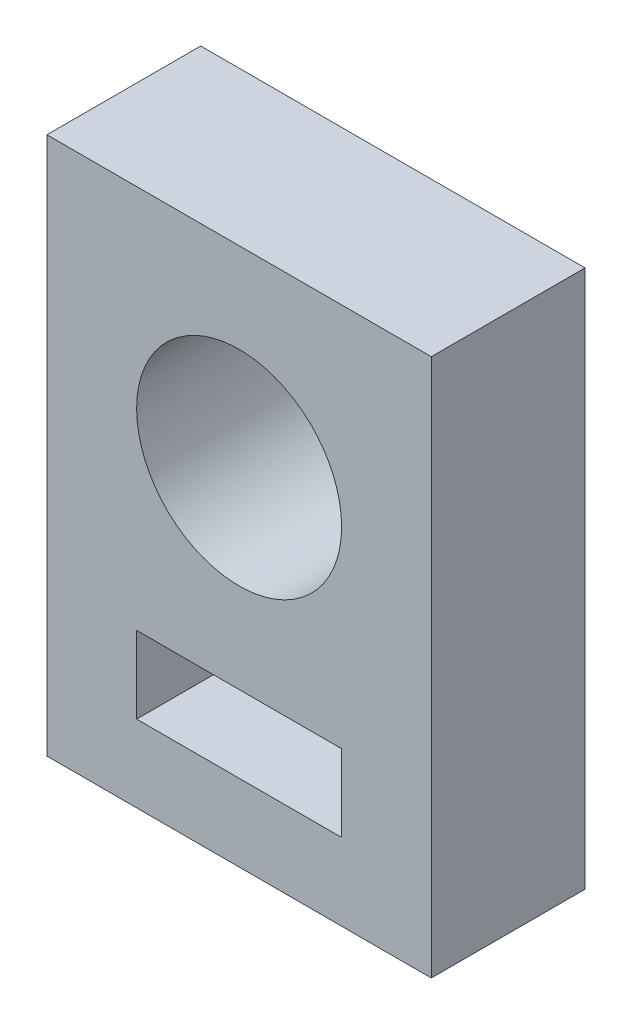
ISO-10303-21;
HEADER;
FILE_DESCRIPTION(('STEP AP214'),'2;1');
FILE_NAME('part.step','',(''),(''),'','','');
FILE_SCHEMA(('AUTOMOTIVE_DESIGN { 1 0 10303 214 1 1 1 1 }'));
ENDSEC;
DATA;
#1=APPLICATION_CONTEXT('core data for automotive mechanical design processes');
#2=APPLICATION_PROTOCOL_DEFINITION('international standard','automotive_design',2000,#1);
#3=PRODUCT_CONTEXT('',#1,'mechanical');
#4=PRODUCT('Part','Part','',(#3));
#5=PRODUCT_RELATED_PRODUCT_CATEGORY('part','',(#4));
#6=PRODUCT_DEFINITION_FORMATION('','',#4);
#7=PRODUCT_DEFINITION_CONTEXT('part definition',#1,'design');
#8=PRODUCT_DEFINITION('design','',#6,#7);
#9=PRODUCT_DEFINITION_SHAPE('','',#8);
#10=(LENGTH_UNIT() NAMED_UNIT(*) SI_UNIT(.MILLI.,.METRE.));
#11=(NAMED_UNIT(*) PLANE_ANGLE_UNIT() SI_UNIT($,.RADIAN.));
#12=(NAMED_UNIT(*) SI_UNIT($,.STERADIAN.) SOLID_ANGLE_UNIT());
#13=UNCERTAINTY_MEASURE_WITH_UNIT(LENGTH_MEASURE(1.E-05),#10,'distance_accuracy_value','');
#14=(GEOMETRIC_REPRESENTATION_CONTEXT(3) GLOBAL_UNCERTAINTY_ASSIGNED_CONTEXT((#13)) GLOBAL_UNIT_ASSIGNED_CONTEXT((#10,
#11,#12)) REPRESENTATION_CONTEXT('',''));
#15=CARTESIAN_POINT('',(0.,0.,0.));
#16=DIRECTION('',(0.,0.,1.));
#17=DIRECTION('',(1.,0.,0.));
#18=AXIS2_PLACEMENT_3D('',#15,#16,#17);
#19=CARTESIAN_POINT('',(0.,0.,6.));
#20=DIRECTION('',(0.,0.,-1.));
#21=DIRECTION('',(-1.,0.,0.));
#22=AXIS2_PLACEMENT_3D('',#19,#20,#21);
#23=PLANE('',#22);
#24=CARTESIAN_POINT('',(0.,3.,6.));
#25=DIRECTION('',(0.,0.,1.));
#26=DIRECTION('',(1.,0.,0.));
#27=AXIS2_PLACEMENT_3D('',#24,#25,#26);
#28=CIRCLE('',#27,4.);
#29=CARTESIAN_POINT('',(4.,3.,6.));
#30=VERTEX_POINT('',#29);
#31=EDGE_CURVE('E137',#30,#30,#28,.T.);
#32=ORIENTED_EDGE('',*,*,#31,.F.);
#33=EDGE_LOOP('',(#32));
#34=FACE_BOUND('',#33,.T.);
#35=DIRECTION('',(0.,1.,0.));
#36=VECTOR('',#35,1.);
#37=CARTESIAN_POINT('',(7.5,-10.5,6.));
#38=LINE('',#37,#36);
#39=CARTESIAN_POINT('',(7.5,-10.5,6.));
#40=VERTEX_POINT('',#39);
#41=CARTESIAN_POINT('',(7.5,10.5,6.));
#42=VERTEX_POINT('',#41);
#43=EDGE_CURVE('E143',#40,#42,#38,.T.);
#44=ORIENTED_EDGE('',*,*,#43,.T.);
#45=DIRECTION('',(-1.,0.,0.));
#46=VECTOR('',#45,1.);
#47=CARTESIAN_POINT('',(-7.5,10.5,6.));
#48=LINE('',#47,#46);
#49=CARTESIAN_POINT('',(-7.5,10.5,6.));
#50=VERTEX_POINT('',#49);
#51=EDGE_CURVE('E146',#42,#50,#48,.T.);
#52=ORIENTED_EDGE('',*,*,#51,.T.);
#53=DIRECTION('',(0.,-1.,0.));
#54=VECTOR('',#53,1.);
#55=CARTESIAN_POINT('',(-7.5,-10.5,6.));
#56=LINE('',#55,#54);
#57=CARTESIAN_POINT('',(-7.5,-10.5,6.));
#58=VERTEX_POINT('',#57);
#59=EDGE_CURVE('E149',#50,#58,#56,.T.);
#60=ORIENTED_EDGE('',*,*,#59,.T.);
#61=DIRECTION('',(1.,0.,0.));
#62=VECTOR('',#61,1.);
#63=CARTESIAN_POINT('',(-7.5,-10.5,6.));
#64=LINE('',#63,#62);
#65=EDGE_CURVE('E151',#58,#40,#64,.T.);
#66=ORIENTED_EDGE('',*,*,#65,.T.);
#67=EDGE_LOOP('',(#44,#52,#60,#66));
#68=FACE_BOUND('',#67,.T.);
#69=DIRECTION('',(0.,1.,0.));
#70=VECTOR('',#69,1.);
#71=CARTESIAN_POINT('',(4.,-7.5,6.));
#72=LINE('',#71,#70);
#73=CARTESIAN_POINT('',(4.,-7.5,6.));
#74=VERTEX_POINT('',#73);
#75=CARTESIAN_POINT('',(4.,-4.5,6.));
#76=VERTEX_POINT('',#75);
#77=EDGE_CURVE('E101',#74,#76,#72,.T.);
#78=ORIENTED_EDGE('',*,*,#77,.F.);
#79=DIRECTION('',(1.,0.,0.));
#80=VECTOR('',#79,1.);
#81=CARTESIAN_POINT('',(-4.,-7.5,6.));
#82=LINE('',#81,#80);
#83=CARTESIAN_POINT('',(-4.,-7.5,6.));
#84=VERTEX_POINT('',#83);
#85=EDGE_CURVE('E123',#84,#74,#82,.T.);
#86=ORIENTED_EDGE('',*,*,#85,.F.);
#87=DIRECTION('',(0.,-1.,0.));
#88=VECTOR('',#87,1.);
#89=CARTESIAN_POINT('',(-4.,-7.5,6.));
#90=LINE('',#89,#88);
#91=CARTESIAN_POINT('',(-4.,-4.5,6.));
#92=VERTEX_POINT('',#91);
#93=EDGE_CURVE('E121',#92,#84,#90,.T.);
#94=ORIENTED_EDGE('',*,*,#93,.F.);
#95=DIRECTION('',(-1.,0.,0.));
#96=VECTOR('',#95,1.);
#97=CARTESIAN_POINT('',(-4.,-4.5,6.));
#98=LINE('',#97,#96);
#99=EDGE_CURVE('E109',#76,#92,#98,.T.);
#100=ORIENTED_EDGE('',*,*,#99,.F.);
#101=EDGE_LOOP('',(#78,#86,#94,#100));
#102=FACE_BOUND('',#101,.T.);
#103=ADVANCED_FACE('F36',(#34,#68,#102),#23,.F.);
#104=CARTESIAN_POINT('',(0.,0.,0.));
#105=DIRECTION('',(0.,0.,-1.));
#106=DIRECTION('',(-1.,0.,0.));
#107=AXIS2_PLACEMENT_3D('',#104,#105,#106);
#108=PLANE('',#107);
#109=DIRECTION('',(0.,1.,0.));
#110=VECTOR('',#109,1.);
#111=CARTESIAN_POINT('',(7.5,-10.5,0.));
#112=LINE('',#111,#110);
#113=CARTESIAN_POINT('',(7.5,-10.5,0.));
#114=VERTEX_POINT('',#113);
#115=CARTESIAN_POINT('',(7.5,10.5,0.));
#116=VERTEX_POINT('',#115);
#117=EDGE_CURVE('E140',#114,#116,#112,.T.);
#118=ORIENTED_EDGE('',*,*,#117,.F.);
#119=DIRECTION('',(1.,0.,0.));
#120=VECTOR('',#119,1.);
#121=CARTESIAN_POINT('',(-7.5,-10.5,0.));
#122=LINE('',#121,#120);
#123=CARTESIAN_POINT('',(-7.5,-10.5,0.));
#124=VERTEX_POINT('',#123);
#125=EDGE_CURVE('E147',#124,#114,#122,.T.);
#126=ORIENTED_EDGE('',*,*,#125,.F.);
#127=DIRECTION('',(0.,-1.,0.));
#128=VECTOR('',#127,1.);
#129=CARTESIAN_POINT('',(-7.5,-10.5,0.));
#130=LINE('',#129,#128);
#131=CARTESIAN_POINT('',(-7.5,10.5,0.));
#132=VERTEX_POINT('',#131);
#133=EDGE_CURVE('E158',#132,#124,#130,.T.);
#134=ORIENTED_EDGE('',*,*,#133,.F.);
#135=DIRECTION('',(-1.,0.,0.));
#136=VECTOR('',#135,1.);
#137=CARTESIAN_POINT('',(-7.5,10.5,0.));
#138=LINE('',#137,#136);
#139=EDGE_CURVE('E156',#116,#132,#138,.T.);
#140=ORIENTED_EDGE('',*,*,#139,.F.);
#141=EDGE_LOOP('',(#118,#126,#134,#140));
#142=FACE_BOUND('',#141,.T.);
#143=CARTESIAN_POINT('',(0.,3.,0.));
#144=DIRECTION('',(0.,0.,1.));
#145=DIRECTION('',(1.,0.,0.));
#146=AXIS2_PLACEMENT_3D('',#143,#144,#145);
#147=CIRCLE('',#146,4.);
#148=CARTESIAN_POINT('',(4.,3.,0.));
#149=VERTEX_POINT('',#148);
#150=EDGE_CURVE('E117',#149,#149,#147,.T.);
#151=ORIENTED_EDGE('',*,*,#150,.T.);
#152=EDGE_LOOP('',(#151));
#153=FACE_BOUND('',#152,.T.);
#154=DIRECTION('',(1.,0.,0.));
#155=VECTOR('',#154,1.);
#156=CARTESIAN_POINT('',(-4.,-7.5,0.));
#157=LINE('',#156,#155);
#158=CARTESIAN_POINT('',(-4.,-7.5,0.));
#159=VERTEX_POINT('',#158);
#160=CARTESIAN_POINT('',(4.,-7.5,0.));
#161=VERTEX_POINT('',#160);
#162=EDGE_CURVE('E110',#159,#161,#157,.T.);
#163=ORIENTED_EDGE('',*,*,#162,.T.);
#164=DIRECTION('',(0.,1.,0.));
#165=VECTOR('',#164,1.);
#166=CARTESIAN_POINT('',(4.,-7.5,0.));
#167=LINE('',#166,#165);
#168=CARTESIAN_POINT('',(4.,-4.5,0.));
#169=VERTEX_POINT('',#168);
#170=EDGE_CURVE('E59',#161,#169,#167,.T.);
#171=ORIENTED_EDGE('',*,*,#170,.T.);
#172=DIRECTION('',(-1.,0.,0.));
#173=VECTOR('',#172,1.);
#174=CARTESIAN_POINT('',(-4.,-4.5,0.));
#175=LINE('',#174,#173);
#176=CARTESIAN_POINT('',(-4.,-4.5,0.));
#177=VERTEX_POINT('',#176);
#178=EDGE_CURVE('E116',#169,#177,#175,.T.);
#179=ORIENTED_EDGE('',*,*,#178,.T.);
#180=DIRECTION('',(0.,-1.,0.));
#181=VECTOR('',#180,1.);
#182=CARTESIAN_POINT('',(-4.,-7.5,0.));
#183=LINE('',#182,#181);
#184=EDGE_CURVE('E129',#177,#159,#183,.T.);
#185=ORIENTED_EDGE('',*,*,#184,.T.);
#186=EDGE_LOOP('',(#163,#171,#179,#185));
#187=FACE_BOUND('',#186,.T.);
#188=ADVANCED_FACE('F176',(#142,#153,#187),#108,.T.);
#189=CARTESIAN_POINT('',(7.5,-10.5,6.));
#190=DIRECTION('',(-1.,0.,0.));
#191=DIRECTION('',(0.,0.,1.));
#192=AXIS2_PLACEMENT_3D('',#189,#190,#191);
#193=PLANE('',#192);
#194=ORIENTED_EDGE('',*,*,#117,.T.);
#195=DIRECTION('',(0.,0.,-1.));
#196=VECTOR('',#195,1.);
#197=CARTESIAN_POINT('',(7.5,10.5,6.));
#198=LINE('',#197,#196);
#199=EDGE_CURVE('E11',#42,#116,#198,.T.);
#200=ORIENTED_EDGE('',*,*,#199,.F.);
#201=ORIENTED_EDGE('',*,*,#43,.F.);
#202=DIRECTION('',(0.,0.,-1.));
#203=VECTOR('',#202,1.);
#204=CARTESIAN_POINT('',(7.5,-10.5,6.));
#205=LINE('',#204,#203);
#206=EDGE_CURVE('E153',#40,#114,#205,.T.);
#207=ORIENTED_EDGE('',*,*,#206,.T.);
#208=EDGE_LOOP('',(#194,#200,#201,#207));
#209=FACE_BOUND('',#208,.T.);
#210=ADVANCED_FACE('F38',(#209),#193,.F.);
#211=CARTESIAN_POINT('',(-7.5,10.5,6.));
#212=DIRECTION('',(0.,-1.,0.));
#213=DIRECTION('',(0.,0.,-1.));
#214=AXIS2_PLACEMENT_3D('',#211,#212,#213);
#215=PLANE('',#214);
#216=ORIENTED_EDGE('',*,*,#139,.T.);
#217=DIRECTION('',(0.,0.,-1.));
#218=VECTOR('',#217,1.);
#219=CARTESIAN_POINT('',(-7.5,10.5,6.));
#220=LINE('',#219,#218);
#221=EDGE_CURVE('E44',#50,#132,#220,.T.);
#222=ORIENTED_EDGE('',*,*,#221,.F.);
#223=ORIENTED_EDGE('',*,*,#51,.F.);
#224=ORIENTED_EDGE('',*,*,#199,.T.);
#225=EDGE_LOOP('',(#216,#222,#223,#224));
#226=FACE_BOUND('',#225,.T.);
#227=ADVANCED_FACE('F186',(#226),#215,.F.);
#228=CARTESIAN_POINT('',(-7.5,-10.5,6.));
#229=DIRECTION('',(1.,0.,0.));
#230=DIRECTION('',(0.,0.,-1.));
#231=AXIS2_PLACEMENT_3D('',#228,#229,#230);
#232=PLANE('',#231);
#233=ORIENTED_EDGE('',*,*,#133,.T.);
#234=DIRECTION('',(0.,0.,-1.));
#235=VECTOR('',#234,1.);
#236=CARTESIAN_POINT('',(-7.5,-10.5,6.));
#237=LINE('',#236,#235);
#238=EDGE_CURVE('E163',#58,#124,#237,.T.);
#239=ORIENTED_EDGE('',*,*,#238,.F.);
#240=ORIENTED_EDGE('',*,*,#59,.F.);
#241=ORIENTED_EDGE('',*,*,#221,.T.);
#242=EDGE_LOOP('',(#233,#239,#240,#241));
#243=FACE_BOUND('',#242,.T.);
#244=ADVANCED_FACE('F170',(#243),#232,.F.);
#245=CARTESIAN_POINT('',(-7.5,-10.5,6.));
#246=DIRECTION('',(0.,1.,0.));
#247=DIRECTION('',(0.,0.,1.));
#248=AXIS2_PLACEMENT_3D('',#245,#246,#247);
#249=PLANE('',#248);
#250=ORIENTED_EDGE('',*,*,#125,.T.);
#251=ORIENTED_EDGE('',*,*,#206,.F.);
#252=ORIENTED_EDGE('',*,*,#65,.F.);
#253=ORIENTED_EDGE('',*,*,#238,.T.);
#254=EDGE_LOOP('',(#250,#251,#252,#253));
#255=FACE_BOUND('',#254,.T.);
#256=ADVANCED_FACE('F180',(#255),#249,.F.);
#257=CARTESIAN_POINT('',(0.,3.,6.));
#258=DIRECTION('',(0.,0.,-1.));
#259=DIRECTION('',(-1.,0.,0.));
#260=AXIS2_PLACEMENT_3D('',#257,#258,#259);
#261=CYLINDRICAL_SURFACE('',#260,4.);
#262=ORIENTED_EDGE('',*,*,#31,.T.);
#263=EDGE_LOOP('',(#262));
#264=FACE_BOUND('',#263,.T.);
#265=ORIENTED_EDGE('',*,*,#150,.F.);
#266=EDGE_LOOP('',(#265));
#267=FACE_BOUND('',#266,.T.);
#268=ADVANCED_FACE('F202',(#264,#267),#261,.F.);
#269=CARTESIAN_POINT('',(4.,-7.5,6.));
#270=DIRECTION('',(-1.,0.,0.));
#271=DIRECTION('',(0.,0.,1.));
#272=AXIS2_PLACEMENT_3D('',#269,#270,#271);
#273=PLANE('',#272);
#274=ORIENTED_EDGE('',*,*,#170,.F.);
#275=DIRECTION('',(0.,0.,-1.));
#276=VECTOR('',#275,1.);
#277=CARTESIAN_POINT('',(4.,-7.5,6.));
#278=LINE('',#277,#276);
#279=EDGE_CURVE('E105',#74,#161,#278,.T.);
#280=ORIENTED_EDGE('',*,*,#279,.F.);
#281=ORIENTED_EDGE('',*,*,#77,.T.);
#282=DIRECTION('',(0.,0.,-1.));
#283=VECTOR('',#282,1.);
#284=CARTESIAN_POINT('',(4.,-4.5,6.));
#285=LINE('',#284,#283);
#286=EDGE_CURVE('E104',#76,#169,#285,.T.);
#287=ORIENTED_EDGE('',*,*,#286,.T.);
#288=EDGE_LOOP('',(#274,#280,#281,#287));
#289=FACE_BOUND('',#288,.T.);
#290=ADVANCED_FACE('F103',(#289),#273,.T.);
#291=CARTESIAN_POINT('',(-4.,-4.5,6.));
#292=DIRECTION('',(0.,-1.,0.));
#293=DIRECTION('',(1.,0.,0.));
#294=AXIS2_PLACEMENT_3D('',#291,#292,#293);
#295=PLANE('',#294);
#296=ORIENTED_EDGE('',*,*,#178,.F.);
#297=ORIENTED_EDGE('',*,*,#286,.F.);
#298=ORIENTED_EDGE('',*,*,#99,.T.);
#299=DIRECTION('',(0.,0.,-1.));
#300=VECTOR('',#299,1.);
#301=CARTESIAN_POINT('',(-4.,-4.5,6.));
#302=LINE('',#301,#300);
#303=EDGE_CURVE('E118',#92,#177,#302,.T.);
#304=ORIENTED_EDGE('',*,*,#303,.T.);
#305=EDGE_LOOP('',(#296,#297,#298,#304));
#306=FACE_BOUND('',#305,.T.);
#307=ADVANCED_FACE('F113',(#306),#295,.T.);
#308=CARTESIAN_POINT('',(-4.,-7.5,6.));
#309=DIRECTION('',(1.,0.,0.));
#310=DIRECTION('',(0.,0.,-1.));
#311=AXIS2_PLACEMENT_3D('',#308,#309,#310);
#312=PLANE('',#311);
#313=ORIENTED_EDGE('',*,*,#184,.F.);
#314=ORIENTED_EDGE('',*,*,#303,.F.);
#315=ORIENTED_EDGE('',*,*,#93,.T.);
#316=DIRECTION('',(0.,0.,-1.));
#317=VECTOR('',#316,1.);
#318=CARTESIAN_POINT('',(-4.,-7.5,6.));
#319=LINE('',#318,#317);
#320=EDGE_CURVE('E51',#84,#159,#319,.T.);
#321=ORIENTED_EDGE('',*,*,#320,.T.);
#322=EDGE_LOOP('',(#313,#314,#315,#321));
#323=FACE_BOUND('',#322,.T.);
#324=ADVANCED_FACE('F219',(#323),#312,.T.);
#325=CARTESIAN_POINT('',(-4.,-7.5,6.));
#326=DIRECTION('',(0.,1.,0.));
#327=DIRECTION('',(0.,0.,1.));
#328=AXIS2_PLACEMENT_3D('',#325,#326,#327);
#329=PLANE('',#328);
#330=ORIENTED_EDGE('',*,*,#162,.F.);
#331=ORIENTED_EDGE('',*,*,#320,.F.);
#332=ORIENTED_EDGE('',*,*,#85,.T.);
#333=ORIENTED_EDGE('',*,*,#279,.T.);
#334=EDGE_LOOP('',(#330,#331,#332,#333));
#335=FACE_BOUND('',#334,.T.);
#336=ADVANCED_FACE('F217',(#335),#329,.T.);
#337=CLOSED_SHELL('',(#103,#188,#210,#227,#244,#256,#268,#290,#307,#324,#336));
#338=MANIFOLD_SOLID_BREP('B2',#337);
#339=ADVANCED_BREP_SHAPE_REPRESENTATION('',(#18,#338),#14);
#340=SHAPE_DEFINITION_REPRESENTATION(#9,#339);
ENDSEC;
END-ISO-10303-21;
